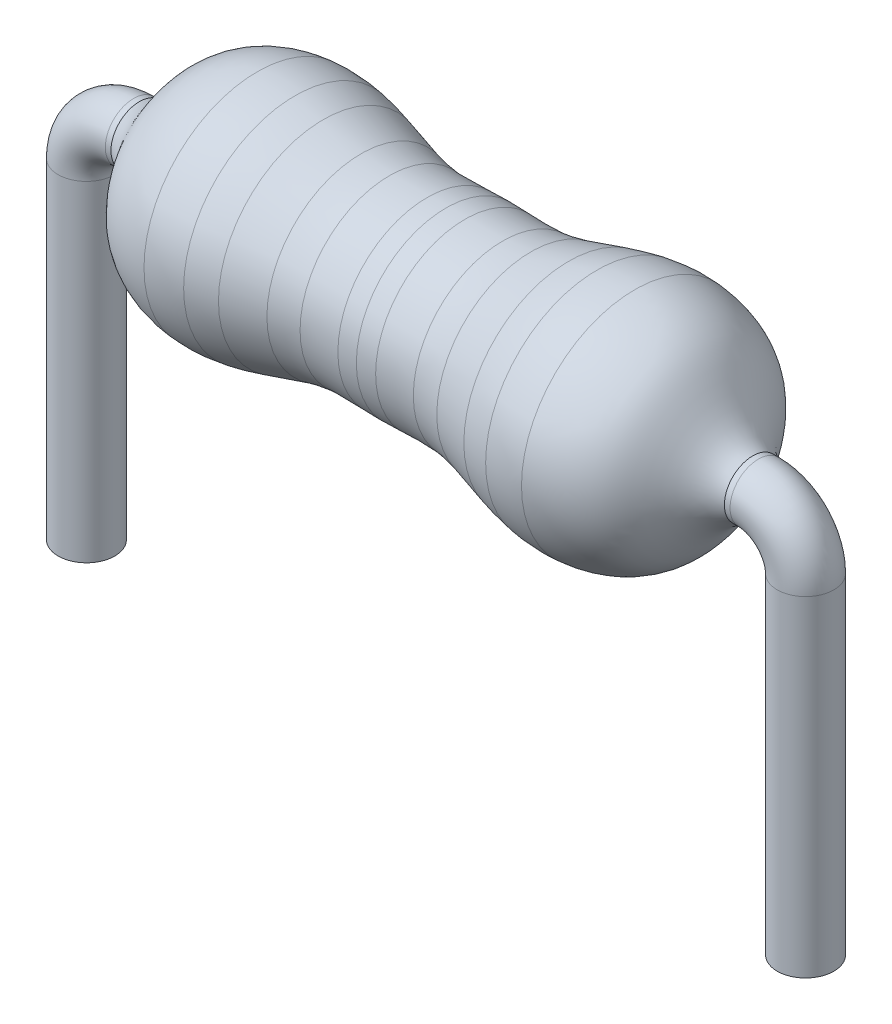
ISO-10303-21;
HEADER;
FILE_DESCRIPTION(('STEP AP214'),'2;1');
FILE_NAME('part.step','',(''),(''),'','','');
FILE_SCHEMA(('AUTOMOTIVE_DESIGN { 1 0 10303 214 1 1 1 1 }'));
ENDSEC;
DATA;
#1=APPLICATION_CONTEXT('core data for automotive mechanical design processes');
#2=APPLICATION_PROTOCOL_DEFINITION('international standard','automotive_design',2000,#1);
#3=PRODUCT_CONTEXT('',#1,'mechanical');
#4=PRODUCT('Part','Part','',(#3));
#5=PRODUCT_RELATED_PRODUCT_CATEGORY('part','',(#4));
#6=PRODUCT_DEFINITION_FORMATION('','',#4);
#7=PRODUCT_DEFINITION_CONTEXT('part definition',#1,'design');
#8=PRODUCT_DEFINITION('design','',#6,#7);
#9=PRODUCT_DEFINITION_SHAPE('','',#8);
#10=(LENGTH_UNIT() NAMED_UNIT(*) SI_UNIT(.MILLI.,.METRE.));
#11=(NAMED_UNIT(*) PLANE_ANGLE_UNIT() SI_UNIT($,.RADIAN.));
#12=(NAMED_UNIT(*) SI_UNIT($,.STERADIAN.) SOLID_ANGLE_UNIT());
#13=UNCERTAINTY_MEASURE_WITH_UNIT(LENGTH_MEASURE(1.E-05),#10,'distance_accuracy_value','');
#14=(GEOMETRIC_REPRESENTATION_CONTEXT(3) GLOBAL_UNCERTAINTY_ASSIGNED_CONTEXT((#13)) GLOBAL_UNIT_ASSIGNED_CONTEXT((#10,
#11,#12)) REPRESENTATION_CONTEXT('',''));
#15=CARTESIAN_POINT('',(0.,0.,0.));
#16=DIRECTION('',(0.,0.,1.));
#17=DIRECTION('',(1.,0.,0.));
#18=AXIS2_PLACEMENT_3D('',#15,#16,#17);
#19=CARTESIAN_POINT('',(-1.6,1.18002524062666,0.));
#20=CARTESIAN_POINT('',(-1.73139921812952,1.20165085484211,0.));
#21=CARTESIAN_POINT('',(-1.86460144268591,1.21054538011363,0.));
#22=CARTESIAN_POINT('',(-2.00000000000192,1.19999999999985,0.));
#23=B_SPLINE_CURVE_WITH_KNOTS('',3,(#19,#20,#21,#22),.UNSPECIFIED.,.F.,.F.,(4,4),
(0.725130753100902,0.780397484348983),.UNSPECIFIED.);
#24=CARTESIAN_POINT('',(0.,0.,0.));
#25=DIRECTION('',(-1.,0.,0.));
#26=AXIS1_PLACEMENT('',#24,#25);
#27=SURFACE_OF_REVOLUTION('',#23,#26);
#28=CARTESIAN_POINT('',(-2.00000008221301,0.,0.));
#29=DIRECTION('',(-1.,0.,0.));
#30=DIRECTION('',(0.,0.,1.));
#31=AXIS2_PLACEMENT_3D('',#28,#29,#30);
#32=CIRCLE('',#31,1.19999995231);
#33=CARTESIAN_POINT('',(-2.00000008221301,0.,1.19999995231));
#34=VERTEX_POINT('',#33);
#35=EDGE_CURVE('E80',#34,#34,#32,.T.);
#36=ORIENTED_EDGE('',*,*,#35,.F.);
#37=EDGE_LOOP('',(#36));
#38=FACE_BOUND('',#37,.T.);
#39=CARTESIAN_POINT('',(-1.6,0.,0.));
#40=DIRECTION('',(-1.,0.,0.));
#41=DIRECTION('',(0.,0.,1.));
#42=AXIS2_PLACEMENT_3D('',#39,#40,#41);
#43=CIRCLE('',#42,1.18002524062666);
#44=CARTESIAN_POINT('',(-1.6,0.,1.18002524062666));
#45=VERTEX_POINT('',#44);
#46=EDGE_CURVE('E10',#45,#45,#43,.T.);
#47=ORIENTED_EDGE('',*,*,#46,.T.);
#48=EDGE_LOOP('',(#47));
#49=FACE_BOUND('',#48,.T.);
#50=ADVANCED_FACE('F33',(#38,#49),#27,.T.);
#51=CARTESIAN_POINT('',(-1.29999999999949,1.11105008155822,0.));
#52=CARTESIAN_POINT('',(-1.34982275992407,1.12502898187491,0.));
#53=CARTESIAN_POINT('',(-1.44929519333072,1.15139313965258,0.));
#54=CARTESIAN_POINT('',(-1.54974358409127,1.17175406612681,0.));
#55=CARTESIAN_POINT('',(-1.6,1.18002524062666,0.));
#56=B_SPLINE_CURVE_WITH_KNOTS('',3,(#51,#52,#53,#54,#55),.UNSPECIFIED.,.F.,.F.,(4,1,4),
(0.682659095606128,0.70399282038661,0.725130753100902),.UNSPECIFIED.);
#57=CARTESIAN_POINT('',(0.,0.,0.));
#58=DIRECTION('',(-1.,0.,0.));
#59=AXIS1_PLACEMENT('',#57,#58);
#60=SURFACE_OF_REVOLUTION('',#56,#59);
#61=ORIENTED_EDGE('',*,*,#46,.F.);
#62=EDGE_LOOP('',(#61));
#63=FACE_BOUND('',#62,.T.);
#64=CARTESIAN_POINT('',(-1.29999999999954,0.,0.));
#65=DIRECTION('',(-1.,0.,0.));
#66=DIRECTION('',(0.,0.,1.));
#67=AXIS2_PLACEMENT_3D('',#64,#65,#66);
#68=CIRCLE('',#67,1.11105008155823);
#69=CARTESIAN_POINT('',(-1.29999999999954,0.,1.11105008155823));
#70=VERTEX_POINT('',#69);
#71=EDGE_CURVE('E40',#70,#70,#68,.T.);
#72=ORIENTED_EDGE('',*,*,#71,.T.);
#73=EDGE_LOOP('',(#72));
#74=FACE_BOUND('',#73,.T.);
#75=ADVANCED_FACE('F95',(#63,#74),#60,.T.);
#76=CARTESIAN_POINT('',(-0.900000000002938,0.997661650819344,0.));
#77=CARTESIAN_POINT('',(-1.03363883795164,1.03072801398973,0.));
#78=CARTESIAN_POINT('',(-1.16630551585749,1.07353907515188,0.));
#79=CARTESIAN_POINT('',(-1.29999999999954,1.11105008155823,0.));
#80=B_SPLINE_CURVE_WITH_KNOTS('',3,(#76,#77,#78,#79),.UNSPECIFIED.,.F.,.F.,(4,4),
(0.625412139924171,0.682659095606134),.UNSPECIFIED.);
#81=CARTESIAN_POINT('',(0.,0.,0.));
#82=DIRECTION('',(-1.,0.,0.));
#83=AXIS1_PLACEMENT('',#81,#82);
#84=SURFACE_OF_REVOLUTION('',#80,#83);
#85=ORIENTED_EDGE('',*,*,#71,.F.);
#86=EDGE_LOOP('',(#85));
#87=FACE_BOUND('',#86,.T.);
#88=CARTESIAN_POINT('',(-0.900000000002907,0.,0.));
#89=DIRECTION('',(-1.,0.,0.));
#90=DIRECTION('',(0.,0.,1.));
#91=AXIS2_PLACEMENT_3D('',#88,#89,#90);
#92=CIRCLE('',#91,0.997661650819337);
#93=CARTESIAN_POINT('',(-0.900000000002907,0.,0.997661650819337));
#94=VERTEX_POINT('',#93);
#95=EDGE_CURVE('E44',#94,#94,#92,.T.);
#96=ORIENTED_EDGE('',*,*,#95,.T.);
#97=EDGE_LOOP('',(#96));
#98=FACE_BOUND('',#97,.T.);
#99=ADVANCED_FACE('F98',(#87,#98),#84,.T.);
#100=CARTESIAN_POINT('',(-0.6,0.946228081779574,0.));
#101=CARTESIAN_POINT('',(-0.616698211097421,0.947554211975146,0.));
#102=CARTESIAN_POINT('',(-0.717557480019262,0.957111908544431,0.));
#103=CARTESIAN_POINT('',(-0.81719844254936,0.977173996093668,0.));
#104=CARTESIAN_POINT('',(-0.900000000002907,0.997661650819337,0.));
#105=B_SPLINE_CURVE_WITH_KNOTS('',3,(#100,#101,#102,#103,#104),.UNSPECIFIED.,.F.,.F.,(4,1,4),
(0.582920396760219,0.589942383057822,0.625412139924171),.UNSPECIFIED.);
#106=CARTESIAN_POINT('',(0.,0.,0.));
#107=DIRECTION('',(-1.,0.,0.));
#108=AXIS1_PLACEMENT('',#106,#107);
#109=SURFACE_OF_REVOLUTION('',#105,#108);
#110=ORIENTED_EDGE('',*,*,#95,.F.);
#111=EDGE_LOOP('',(#110));
#112=FACE_BOUND('',#111,.T.);
#113=CARTESIAN_POINT('',(-0.599999999999969,0.,0.));
#114=DIRECTION('',(-1.,0.,0.));
#115=DIRECTION('',(0.,0.,1.));
#116=AXIS2_PLACEMENT_3D('',#113,#114,#115);
#117=CIRCLE('',#116,0.946228081779572);
#118=CARTESIAN_POINT('',(-0.599999999999969,0.,0.946228081779572));
#119=VERTEX_POINT('',#118);
#120=EDGE_CURVE('E48',#119,#119,#117,.T.);
#121=ORIENTED_EDGE('',*,*,#120,.T.);
#122=EDGE_LOOP('',(#121));
#123=FACE_BOUND('',#122,.T.);
#124=ADVANCED_FACE('F102',(#112,#123),#109,.T.);
#125=CARTESIAN_POINT('',(-0.199999999999563,0.945686937032062,0.));
#126=CARTESIAN_POINT('',(-0.334396136138305,0.941079864095734,0.));
#127=CARTESIAN_POINT('',(-0.468154450978546,0.935757237765867,0.));
#128=CARTESIAN_POINT('',(-0.599999999999969,0.946228081779572,0.));
#129=B_SPLINE_CURVE_WITH_KNOTS('',3,(#125,#126,#127,#128),.UNSPECIFIED.,.F.,.F.,(4,4),
(0.527476275636896,0.582920396760219),.UNSPECIFIED.);
#130=CARTESIAN_POINT('',(0.,0.,0.));
#131=DIRECTION('',(-1.,0.,0.));
#132=AXIS1_PLACEMENT('',#130,#131);
#133=SURFACE_OF_REVOLUTION('',#129,#132);
#134=ORIENTED_EDGE('',*,*,#120,.F.);
#135=EDGE_LOOP('',(#134));
#136=FACE_BOUND('',#135,.T.);
#137=CARTESIAN_POINT('',(-0.2,0.,0.));
#138=DIRECTION('',(-1.,0.,0.));
#139=DIRECTION('',(0.,0.,1.));
#140=AXIS2_PLACEMENT_3D('',#137,#138,#139);
#141=CIRCLE('',#140,0.945686937032046);
#142=CARTESIAN_POINT('',(-0.2,0.,0.945686937032046));
#143=VERTEX_POINT('',#142);
#144=EDGE_CURVE('E53',#143,#143,#141,.T.);
#145=ORIENTED_EDGE('',*,*,#144,.T.);
#146=EDGE_LOOP('',(#145));
#147=FACE_BOUND('',#146,.T.);
#148=ADVANCED_FACE('F106',(#136,#147),#133,.T.);
#149=CARTESIAN_POINT('',(0.,0.95,0.));
#150=CARTESIAN_POINT('',(-0.0667198607743776,0.950074873737409,0.));
#151=CARTESIAN_POINT('',(-0.133438155491727,0.947968663882511,0.));
#152=CARTESIAN_POINT('',(-0.2,0.945686937032046,0.));
#153=B_SPLINE_CURVE_WITH_KNOTS('',3,(#149,#150,#151,#152),.UNSPECIFIED.,.F.,.F.,(4,4),
(0.500016684348567,0.527476275636956),.UNSPECIFIED.);
#154=CARTESIAN_POINT('',(0.,0.,0.));
#155=DIRECTION('',(-1.,0.,0.));
#156=AXIS1_PLACEMENT('',#154,#155);
#157=SURFACE_OF_REVOLUTION('',#153,#156);
#158=ORIENTED_EDGE('',*,*,#144,.F.);
#159=EDGE_LOOP('',(#158));
#160=FACE_BOUND('',#159,.T.);
#161=CARTESIAN_POINT('',(0.,0.,0.));
#162=DIRECTION('',(-1.,0.,0.));
#163=DIRECTION('',(0.,0.,1.));
#164=AXIS2_PLACEMENT_3D('',#161,#162,#163);
#165=CIRCLE('',#164,0.95);
#166=CARTESIAN_POINT('',(0.,0.,0.95));
#167=VERTEX_POINT('',#166);
#168=EDGE_CURVE('E56',#167,#167,#165,.T.);
#169=ORIENTED_EDGE('',*,*,#168,.T.);
#170=EDGE_LOOP('',(#169));
#171=FACE_BOUND('',#170,.T.);
#172=ADVANCED_FACE('F134',(#160,#171),#157,.T.);
#173=CARTESIAN_POINT('',(0.2,0.945686937032046,0.));
#174=CARTESIAN_POINT('',(0.133438155491727,0.947968663882511,0.));
#175=CARTESIAN_POINT('',(0.0667198607743776,0.950074873737409,0.));
#176=CARTESIAN_POINT('',(0.,0.95,0.));
#177=B_SPLINE_CURVE_WITH_KNOTS('',3,(#173,#174,#175,#176),.UNSPECIFIED.,.F.,.F.,(4,4),
(0.500016684348567,0.527476275636956),.UNSPECIFIED.);
#178=CARTESIAN_POINT('',(0.,0.,0.));
#179=DIRECTION('',(-1.,0.,0.));
#180=AXIS1_PLACEMENT('',#178,#179);
#181=SURFACE_OF_REVOLUTION('',#177,#180);
#182=ORIENTED_EDGE('',*,*,#168,.F.);
#183=EDGE_LOOP('',(#182));
#184=FACE_BOUND('',#183,.T.);
#185=CARTESIAN_POINT('',(0.199999999999563,0.,0.));
#186=DIRECTION('',(-1.,0.,0.));
#187=DIRECTION('',(0.,0.,1.));
#188=AXIS2_PLACEMENT_3D('',#185,#186,#187);
#189=CIRCLE('',#188,0.945686937032062);
#190=CARTESIAN_POINT('',(0.199999999999563,0.,0.945686937032062));
#191=VERTEX_POINT('',#190);
#192=EDGE_CURVE('E59',#191,#191,#189,.T.);
#193=ORIENTED_EDGE('',*,*,#192,.T.);
#194=EDGE_LOOP('',(#193));
#195=FACE_BOUND('',#194,.T.);
#196=ADVANCED_FACE('F137',(#184,#195),#181,.T.);
#197=CARTESIAN_POINT('',(0.599999999999969,0.946228081779572,0.));
#198=CARTESIAN_POINT('',(0.468154450978546,0.935757237765867,0.));
#199=CARTESIAN_POINT('',(0.334396136138305,0.941079864095734,0.));
#200=CARTESIAN_POINT('',(0.199999999999563,0.945686937032062,0.));
#201=B_SPLINE_CURVE_WITH_KNOTS('',3,(#197,#198,#199,#200),.UNSPECIFIED.,.F.,.F.,(4,4),
(0.527476275636896,0.582920396760219),.UNSPECIFIED.);
#202=CARTESIAN_POINT('',(0.,0.,0.));
#203=DIRECTION('',(-1.,0.,0.));
#204=AXIS1_PLACEMENT('',#202,#203);
#205=SURFACE_OF_REVOLUTION('',#201,#204);
#206=ORIENTED_EDGE('',*,*,#192,.F.);
#207=EDGE_LOOP('',(#206));
#208=FACE_BOUND('',#207,.T.);
#209=CARTESIAN_POINT('',(0.6,0.,0.));
#210=DIRECTION('',(-1.,0.,0.));
#211=DIRECTION('',(0.,0.,1.));
#212=AXIS2_PLACEMENT_3D('',#209,#210,#211);
#213=CIRCLE('',#212,0.946228081779574);
#214=CARTESIAN_POINT('',(0.6,0.,0.946228081779574));
#215=VERTEX_POINT('',#214);
#216=EDGE_CURVE('E62',#215,#215,#213,.T.);
#217=ORIENTED_EDGE('',*,*,#216,.T.);
#218=EDGE_LOOP('',(#217));
#219=FACE_BOUND('',#218,.T.);
#220=ADVANCED_FACE('F141',(#208,#219),#205,.T.);
#221=CARTESIAN_POINT('',(0.900000000002907,0.997661650819337,0.));
#222=CARTESIAN_POINT('',(0.81719844254936,0.977173996093668,0.));
#223=CARTESIAN_POINT('',(0.717557480019262,0.957111908544431,0.));
#224=CARTESIAN_POINT('',(0.616698211097421,0.947554211975146,0.));
#225=CARTESIAN_POINT('',(0.6,0.946228081779574,0.));
#226=B_SPLINE_CURVE_WITH_KNOTS('',3,(#221,#222,#223,#224,#225),.UNSPECIFIED.,.F.,.F.,(4,1,4),
(0.582920396760219,0.618390153626567,0.625412139924171),.UNSPECIFIED.);
#227=CARTESIAN_POINT('',(0.,0.,0.));
#228=DIRECTION('',(-1.,0.,0.));
#229=AXIS1_PLACEMENT('',#227,#228);
#230=SURFACE_OF_REVOLUTION('',#226,#229);
#231=ORIENTED_EDGE('',*,*,#216,.F.);
#232=EDGE_LOOP('',(#231));
#233=FACE_BOUND('',#232,.T.);
#234=CARTESIAN_POINT('',(0.900000000002938,0.,0.));
#235=DIRECTION('',(-1.,0.,0.));
#236=DIRECTION('',(0.,0.,1.));
#237=AXIS2_PLACEMENT_3D('',#234,#235,#236);
#238=CIRCLE('',#237,0.997661650819344);
#239=CARTESIAN_POINT('',(0.900000000002938,0.,0.997661650819344));
#240=VERTEX_POINT('',#239);
#241=EDGE_CURVE('E65',#240,#240,#238,.T.);
#242=ORIENTED_EDGE('',*,*,#241,.T.);
#243=EDGE_LOOP('',(#242));
#244=FACE_BOUND('',#243,.T.);
#245=ADVANCED_FACE('F145',(#233,#244),#230,.T.);
#246=CARTESIAN_POINT('',(1.29999999999954,1.11105008155823,0.));
#247=CARTESIAN_POINT('',(1.16630551585749,1.07353907515188,0.));
#248=CARTESIAN_POINT('',(1.03363883795164,1.03072801398973,0.));
#249=CARTESIAN_POINT('',(0.900000000002938,0.997661650819344,0.));
#250=B_SPLINE_CURVE_WITH_KNOTS('',3,(#246,#247,#248,#249),.UNSPECIFIED.,.F.,.F.,(4,4),
(0.625412139924171,0.682659095606134),.UNSPECIFIED.);
#251=CARTESIAN_POINT('',(0.,0.,0.));
#252=DIRECTION('',(-1.,0.,0.));
#253=AXIS1_PLACEMENT('',#251,#252);
#254=SURFACE_OF_REVOLUTION('',#250,#253);
#255=ORIENTED_EDGE('',*,*,#241,.F.);
#256=EDGE_LOOP('',(#255));
#257=FACE_BOUND('',#256,.T.);
#258=CARTESIAN_POINT('',(1.29999999999949,0.,0.));
#259=DIRECTION('',(-1.,0.,0.));
#260=DIRECTION('',(0.,0.,1.));
#261=AXIS2_PLACEMENT_3D('',#258,#259,#260);
#262=CIRCLE('',#261,1.11105008155822);
#263=CARTESIAN_POINT('',(1.29999999999949,0.,1.11105008155822));
#264=VERTEX_POINT('',#263);
#265=EDGE_CURVE('E68',#264,#264,#262,.T.);
#266=ORIENTED_EDGE('',*,*,#265,.T.);
#267=EDGE_LOOP('',(#266));
#268=FACE_BOUND('',#267,.T.);
#269=ADVANCED_FACE('F173',(#257,#268),#254,.T.);
#270=CARTESIAN_POINT('',(1.6,1.18002524062666,0.));
#271=CARTESIAN_POINT('',(1.54974358409127,1.17175406612681,0.));
#272=CARTESIAN_POINT('',(1.44929519333072,1.15139313965258,0.));
#273=CARTESIAN_POINT('',(1.34982275992407,1.12502898187491,0.));
#274=CARTESIAN_POINT('',(1.29999999999949,1.11105008155822,0.));
#275=B_SPLINE_CURVE_WITH_KNOTS('',3,(#270,#271,#272,#273,#274),.UNSPECIFIED.,.F.,.F.,(4,1,4),
(0.682659095606128,0.70379702832042,0.725130753100902),.UNSPECIFIED.);
#276=CARTESIAN_POINT('',(0.,0.,0.));
#277=DIRECTION('',(-1.,0.,0.));
#278=AXIS1_PLACEMENT('',#276,#277);
#279=SURFACE_OF_REVOLUTION('',#275,#278);
#280=ORIENTED_EDGE('',*,*,#265,.F.);
#281=EDGE_LOOP('',(#280));
#282=FACE_BOUND('',#281,.T.);
#283=CARTESIAN_POINT('',(1.6,0.,0.));
#284=DIRECTION('',(-1.,0.,0.));
#285=DIRECTION('',(0.,0.,1.));
#286=AXIS2_PLACEMENT_3D('',#283,#284,#285);
#287=CIRCLE('',#286,1.18002524062666);
#288=CARTESIAN_POINT('',(1.6,0.,1.18002524062666));
#289=VERTEX_POINT('',#288);
#290=EDGE_CURVE('E71',#289,#289,#287,.T.);
#291=ORIENTED_EDGE('',*,*,#290,.T.);
#292=EDGE_LOOP('',(#291));
#293=FACE_BOUND('',#292,.T.);
#294=ADVANCED_FACE('F176',(#282,#293),#279,.T.);
#295=CARTESIAN_POINT('',(2.00000000000192,1.19999999999985,0.));
#296=CARTESIAN_POINT('',(1.86460144268591,1.21054538011363,0.));
#297=CARTESIAN_POINT('',(1.73139921812952,1.20165085484211,0.));
#298=CARTESIAN_POINT('',(1.6,1.18002524062666,0.));
#299=B_SPLINE_CURVE_WITH_KNOTS('',3,(#295,#296,#297,#298),.UNSPECIFIED.,.F.,.F.,(4,4),
(0.725130753100902,0.780397484348983),.UNSPECIFIED.);
#300=CARTESIAN_POINT('',(0.,0.,0.));
#301=DIRECTION('',(-1.,0.,0.));
#302=AXIS1_PLACEMENT('',#300,#301);
#303=SURFACE_OF_REVOLUTION('',#299,#302);
#304=ORIENTED_EDGE('',*,*,#290,.F.);
#305=EDGE_LOOP('',(#304));
#306=FACE_BOUND('',#305,.T.);
#307=CARTESIAN_POINT('',(2.00000008221301,0.,0.));
#308=DIRECTION('',(-1.,0.,0.));
#309=DIRECTION('',(0.,0.,1.));
#310=AXIS2_PLACEMENT_3D('',#307,#308,#309);
#311=CIRCLE('',#310,1.19999995231);
#312=CARTESIAN_POINT('',(2.00000008221301,0.,1.19999995231));
#313=VERTEX_POINT('',#312);
#314=EDGE_CURVE('E74',#313,#313,#311,.T.);
#315=ORIENTED_EDGE('',*,*,#314,.T.);
#316=EDGE_LOOP('',(#315));
#317=FACE_BOUND('',#316,.T.);
#318=ADVANCED_FACE('F180',(#306,#317),#303,.T.);
#319=CARTESIAN_POINT('',(3.2499998922858,0.300000089056362,0.));
#320=CARTESIAN_POINT('',(2.97114489163779,0.430097598164328,0.));
#321=CARTESIAN_POINT('',(2.78926367890958,1.00505202041229,0.));
#322=CARTESIAN_POINT('',(2.2360430201822,1.18161598608909,0.));
#323=CARTESIAN_POINT('',(2.00000008221301,1.19999995231,0.));
#324=B_SPLINE_CURVE_WITH_KNOTS('',3,(#319,#320,#321,#322,#323),.UNSPECIFIED.,.F.,.F.,(4,1,4),
(0.780397484348983,0.903652418042311,1.),.UNSPECIFIED.);
#325=CARTESIAN_POINT('',(0.,0.,0.));
#326=DIRECTION('',(-1.,0.,0.));
#327=AXIS1_PLACEMENT('',#325,#326);
#328=SURFACE_OF_REVOLUTION('',#324,#327);
#329=ORIENTED_EDGE('',*,*,#314,.F.);
#330=EDGE_LOOP('',(#329));
#331=FACE_BOUND('',#330,.T.);
#332=CARTESIAN_POINT('',(3.25,0.,0.));
#333=DIRECTION('',(-1.,0.,0.));
#334=DIRECTION('',(0.,0.,1.));
#335=AXIS2_PLACEMENT_3D('',#332,#333,#334);
#336=CIRCLE('',#335,0.300000000000001);
#337=CARTESIAN_POINT('',(3.25,0.,0.300000000000001));
#338=VERTEX_POINT('',#337);
#339=EDGE_CURVE('E83',#338,#338,#336,.T.);
#340=ORIENTED_EDGE('',*,*,#339,.T.);
#341=EDGE_LOOP('',(#340));
#342=FACE_BOUND('',#341,.T.);
#343=ADVANCED_FACE('F184',(#331,#342),#328,.T.);
#344=CARTESIAN_POINT('',(-2.00000008221301,1.19999995231,0.));
#345=CARTESIAN_POINT('',(-2.2360430201822,1.18161598608909,0.));
#346=CARTESIAN_POINT('',(-2.78926367890958,1.00505202041229,0.));
#347=CARTESIAN_POINT('',(-2.97114489163779,0.430097598164328,0.));
#348=CARTESIAN_POINT('',(-3.2499998922858,0.300000089056362,0.));
#349=B_SPLINE_CURVE_WITH_KNOTS('',3,(#344,#345,#346,#347,#348),.UNSPECIFIED.,.F.,.F.,(4,1,4),
(0.780397484348983,0.876745066306672,1.),.UNSPECIFIED.);
#350=CARTESIAN_POINT('',(0.,0.,0.));
#351=DIRECTION('',(-1.,0.,0.));
#352=AXIS1_PLACEMENT('',#350,#351);
#353=SURFACE_OF_REVOLUTION('',#349,#352);
#354=CARTESIAN_POINT('',(-3.2499998922858,0.,0.));
#355=DIRECTION('',(-1.,0.,0.));
#356=DIRECTION('',(0.,0.,1.));
#357=AXIS2_PLACEMENT_3D('',#354,#355,#356);
#358=CIRCLE('',#357,0.300000089056362);
#359=CARTESIAN_POINT('',(-3.2499998922858,0.,0.300000089056362));
#360=VERTEX_POINT('',#359);
#361=EDGE_CURVE('E77',#360,#360,#358,.T.);
#362=ORIENTED_EDGE('',*,*,#361,.F.);
#363=EDGE_LOOP('',(#362));
#364=FACE_BOUND('',#363,.T.);
#365=ORIENTED_EDGE('',*,*,#35,.T.);
#366=EDGE_LOOP('',(#365));
#367=FACE_BOUND('',#366,.T.);
#368=ADVANCED_FACE('F211',(#364,#367),#353,.T.);
#369=CARTESIAN_POINT('',(3.31,0.,0.));
#370=DIRECTION('',(-1.,0.,0.));
#371=DIRECTION('',(0.,0.,1.));
#372=AXIS2_PLACEMENT_3D('',#369,#370,#371);
#373=CYLINDRICAL_SURFACE('',#372,0.300000000000001);
#374=CARTESIAN_POINT('',(3.31,0.,0.));
#375=DIRECTION('',(-1.,0.,0.));
#376=DIRECTION('',(0.,0.,1.));
#377=AXIS2_PLACEMENT_3D('',#374,#375,#376);
#378=CIRCLE('',#377,0.300000000000001);
#379=CARTESIAN_POINT('',(3.30999999999999,0.300000000000001,0.));
#380=VERTEX_POINT('',#379);
#381=EDGE_CURVE('E402',#380,#380,#378,.T.);
#382=ORIENTED_EDGE('',*,*,#381,.T.);
#383=EDGE_LOOP('',(#382));
#384=FACE_BOUND('',#383,.T.);
#385=ORIENTED_EDGE('',*,*,#339,.F.);
#386=EDGE_LOOP('',(#385));
#387=FACE_BOUND('',#386,.T.);
#388=ADVANCED_FACE('F214',(#384,#387),#373,.T.);
#389=CARTESIAN_POINT('',(3.31,-0.5,0.));
#390=DIRECTION('',(0.,0.,1.));
#391=DIRECTION('',(1.,0.,0.));
#392=AXIS2_PLACEMENT_3D('',#389,#390,#391);
#393=TOROIDAL_SURFACE('',#392,0.5,0.300000000000001);
#394=CARTESIAN_POINT('',(3.81,-0.500000000000003,0.));
#395=DIRECTION('',(0.,1.,0.));
#396=DIRECTION('',(0.,0.,1.));
#397=AXIS2_PLACEMENT_3D('',#394,#395,#396);
#398=CIRCLE('',#397,0.300000000000001);
#399=CARTESIAN_POINT('',(4.11,-0.500000000000006,0.));
#400=VERTEX_POINT('',#399);
#401=EDGE_CURVE('E404',#400,#400,#398,.T.);
#402=CARTESIAN_POINT('',(3.31,-0.5,0.));
#403=DIRECTION('',(0.,0.,1.));
#404=DIRECTION('',(1.,0.,0.));
#405=AXIS2_PLACEMENT_3D('',#402,#403,#404);
#406=CIRCLE('',#405,0.800000000000001);
#407=EDGE_CURVE('',#400,#380,#406,.T.);
#408=ORIENTED_EDGE('',*,*,#401,.T.);
#409=ORIENTED_EDGE('',*,*,#381,.F.);
#410=ORIENTED_EDGE('',*,*,#407,.T.);
#411=ORIENTED_EDGE('',*,*,#407,.F.);
#412=EDGE_LOOP('',(#408,#410,#409,#411));
#413=FACE_BOUND('',#412,.T.);
#414=ADVANCED_FACE('F218',(#413),#393,.T.);
#415=CARTESIAN_POINT('',(3.81,-0.500000000000003,0.));
#416=DIRECTION('',(0.,-1.,0.));
#417=DIRECTION('',(1.,0.,0.));
#418=AXIS2_PLACEMENT_3D('',#415,#416,#417);
#419=CYLINDRICAL_SURFACE('',#418,0.300000000000001);
#420=ORIENTED_EDGE('',*,*,#401,.F.);
#421=EDGE_LOOP('',(#420));
#422=FACE_BOUND('',#421,.T.);
#423=CARTESIAN_POINT('',(3.81,-4.,0.));
#424=DIRECTION('',(0.,1.,0.));
#425=DIRECTION('',(0.,0.,1.));
#426=AXIS2_PLACEMENT_3D('',#423,#424,#425);
#427=CIRCLE('',#426,0.300000000000001);
#428=CARTESIAN_POINT('',(3.81,-4.,0.300000000000001));
#429=VERTEX_POINT('',#428);
#430=EDGE_CURVE('E407',#429,#429,#427,.T.);
#431=ORIENTED_EDGE('',*,*,#430,.T.);
#432=EDGE_LOOP('',(#431));
#433=FACE_BOUND('',#432,.T.);
#434=ADVANCED_FACE('F222',(#422,#433),#419,.T.);
#435=CARTESIAN_POINT('',(3.81,-4.,0.));
#436=DIRECTION('',(0.,1.,0.));
#437=DIRECTION('',(0.,0.,1.));
#438=AXIS2_PLACEMENT_3D('',#435,#436,#437);
#439=PLANE('',#438);
#440=ORIENTED_EDGE('',*,*,#430,.F.);
#441=EDGE_LOOP('',(#440));
#442=FACE_BOUND('',#441,.T.);
#443=ADVANCED_FACE('F226',(#442),#439,.F.);
#444=CARTESIAN_POINT('',(-3.31,0.,0.));
#445=DIRECTION('',(1.,0.,0.));
#446=DIRECTION('',(0.,0.,-1.));
#447=AXIS2_PLACEMENT_3D('',#444,#445,#446);
#448=CYLINDRICAL_SURFACE('',#447,0.300000000000001);
#449=CARTESIAN_POINT('',(-3.31,0.,0.));
#450=DIRECTION('',(-1.,0.,0.));
#451=DIRECTION('',(0.,0.,1.));
#452=AXIS2_PLACEMENT_3D('',#449,#450,#451);
#453=CIRCLE('',#452,0.300000000000001);
#454=CARTESIAN_POINT('',(-3.30999999999999,0.300000000000001,0.));
#455=VERTEX_POINT('',#454);
#456=EDGE_CURVE('E410',#455,#455,#453,.T.);
#457=ORIENTED_EDGE('',*,*,#456,.F.);
#458=EDGE_LOOP('',(#457));
#459=FACE_BOUND('',#458,.T.);
#460=ORIENTED_EDGE('',*,*,#361,.T.);
#461=EDGE_LOOP('',(#460));
#462=FACE_BOUND('',#461,.T.);
#463=ADVANCED_FACE('F230',(#459,#462),#448,.T.);
#464=CARTESIAN_POINT('',(-3.31,-0.5,0.));
#465=DIRECTION('',(0.,0.,-1.));
#466=DIRECTION('',(-1.,0.,0.));
#467=AXIS2_PLACEMENT_3D('',#464,#465,#466);
#468=TOROIDAL_SURFACE('',#467,0.5,0.300000000000001);
#469=CARTESIAN_POINT('',(-3.81,-0.500000000000003,0.));
#470=DIRECTION('',(0.,-1.,0.));
#471=DIRECTION('',(0.,0.,1.));
#472=AXIS2_PLACEMENT_3D('',#469,#470,#471);
#473=CIRCLE('',#472,0.300000000000001);
#474=CARTESIAN_POINT('',(-4.11,-0.500000000000006,0.));
#475=VERTEX_POINT('',#474);
#476=EDGE_CURVE('E415',#475,#475,#473,.T.);
#477=CARTESIAN_POINT('',(-3.31,-0.5,0.));
#478=DIRECTION('',(0.,0.,-1.));
#479=DIRECTION('',(-1.,0.,0.));
#480=AXIS2_PLACEMENT_3D('',#477,#478,#479);
#481=CIRCLE('',#480,0.800000000000001);
#482=EDGE_CURVE('',#475,#455,#481,.T.);
#483=ORIENTED_EDGE('',*,*,#476,.F.);
#484=ORIENTED_EDGE('',*,*,#456,.T.);
#485=ORIENTED_EDGE('',*,*,#482,.T.);
#486=ORIENTED_EDGE('',*,*,#482,.F.);
#487=EDGE_LOOP('',(#483,#485,#484,#486));
#488=FACE_BOUND('',#487,.T.);
#489=ADVANCED_FACE('F234',(#488),#468,.T.);
#490=CARTESIAN_POINT('',(-3.81,-0.500000000000003,0.));
#491=DIRECTION('',(0.,-1.,0.));
#492=DIRECTION('',(1.,0.,0.));
#493=AXIS2_PLACEMENT_3D('',#490,#491,#492);
#494=CYLINDRICAL_SURFACE('',#493,0.300000000000001);
#495=ORIENTED_EDGE('',*,*,#476,.T.);
#496=EDGE_LOOP('',(#495));
#497=FACE_BOUND('',#496,.T.);
#498=CARTESIAN_POINT('',(-3.81,-4.,0.));
#499=DIRECTION('',(0.,-1.,0.));
#500=DIRECTION('',(0.,0.,1.));
#501=AXIS2_PLACEMENT_3D('',#498,#499,#500);
#502=CIRCLE('',#501,0.300000000000001);
#503=CARTESIAN_POINT('',(-3.81,-4.,0.300000000000001));
#504=VERTEX_POINT('',#503);
#505=EDGE_CURVE('E416',#504,#504,#502,.T.);
#506=ORIENTED_EDGE('',*,*,#505,.F.);
#507=EDGE_LOOP('',(#506));
#508=FACE_BOUND('',#507,.T.);
#509=ADVANCED_FACE('F238',(#497,#508),#494,.T.);
#510=CARTESIAN_POINT('',(-3.81,-4.,0.));
#511=DIRECTION('',(0.,1.,0.));
#512=DIRECTION('',(0.,0.,1.));
#513=AXIS2_PLACEMENT_3D('',#510,#511,#512);
#514=PLANE('',#513);
#515=ORIENTED_EDGE('',*,*,#505,.T.);
#516=EDGE_LOOP('',(#515));
#517=FACE_BOUND('',#516,.T.);
#518=ADVANCED_FACE('F242',(#517),#514,.F.);
#519=CLOSED_SHELL('',(#50,#75,#99,#124,#148,#172,#196,#220,#245,#269,#294,#318,#343,#368,#388,
#414,#434,#443,#463,#489,#509,#518));
#520=MANIFOLD_SOLID_BREP('B2',#519);
#521=ADVANCED_BREP_SHAPE_REPRESENTATION('',(#18,#520),#14);
#522=SHAPE_DEFINITION_REPRESENTATION(#9,#521);
ENDSEC;
END-ISO-10303-21;
